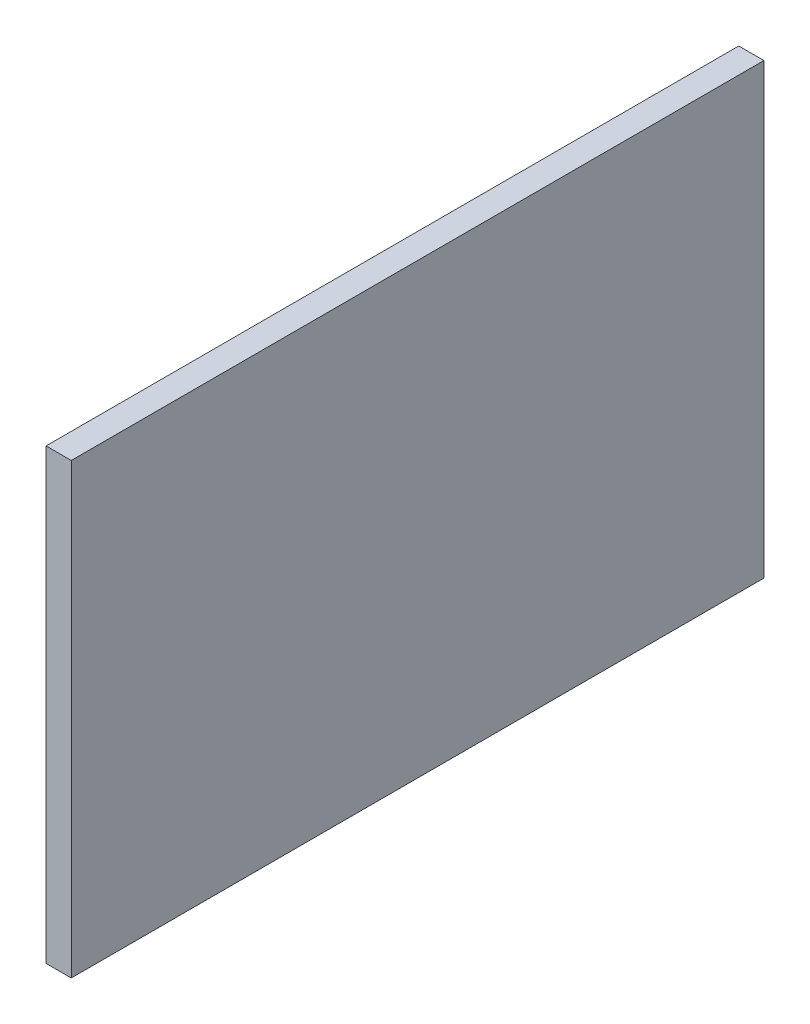
ISO-10303-21;
HEADER;
FILE_DESCRIPTION(('STEP AP214'),'2;1');
FILE_NAME('part.step','',(''),(''),'','','');
FILE_SCHEMA(('AUTOMOTIVE_DESIGN { 1 0 10303 214 1 1 1 1 }'));
ENDSEC;
DATA;
#1=APPLICATION_CONTEXT('core data for automotive mechanical design processes');
#2=APPLICATION_PROTOCOL_DEFINITION('international standard','automotive_design',2000,#1);
#3=PRODUCT_CONTEXT('',#1,'mechanical');
#4=PRODUCT('Part','Part','',(#3));
#5=PRODUCT_RELATED_PRODUCT_CATEGORY('part','',(#4));
#6=PRODUCT_DEFINITION_FORMATION('','',#4);
#7=PRODUCT_DEFINITION_CONTEXT('part definition',#1,'design');
#8=PRODUCT_DEFINITION('design','',#6,#7);
#9=PRODUCT_DEFINITION_SHAPE('','',#8);
#10=(LENGTH_UNIT() NAMED_UNIT(*) SI_UNIT(.MILLI.,.METRE.));
#11=(NAMED_UNIT(*) PLANE_ANGLE_UNIT() SI_UNIT($,.RADIAN.));
#12=(NAMED_UNIT(*) SI_UNIT($,.STERADIAN.) SOLID_ANGLE_UNIT());
#13=UNCERTAINTY_MEASURE_WITH_UNIT(LENGTH_MEASURE(1.E-05),#10,'distance_accuracy_value','');
#14=(GEOMETRIC_REPRESENTATION_CONTEXT(3) GLOBAL_UNCERTAINTY_ASSIGNED_CONTEXT((#13)) GLOBAL_UNIT_ASSIGNED_CONTEXT((#10,
#11,#12)) REPRESENTATION_CONTEXT('',''));
#15=CARTESIAN_POINT('',(0.,0.,0.));
#16=DIRECTION('',(0.,0.,1.));
#17=DIRECTION('',(1.,0.,0.));
#18=AXIS2_PLACEMENT_3D('',#15,#16,#17);
#19=CARTESIAN_POINT('',(10.,0.,-275.));
#20=DIRECTION('',(0.,1.,0.));
#21=DIRECTION('',(0.,0.,1.));
#22=AXIS2_PLACEMENT_3D('',#19,#20,#21);
#23=PLANE('',#22);
#24=DIRECTION('',(0.,0.,-1.));
#25=VECTOR('',#24,1.);
#26=CARTESIAN_POINT('',(0.,0.,-275.));
#27=LINE('',#26,#25);
#28=CARTESIAN_POINT('',(0.,0.,0.));
#29=VERTEX_POINT('',#28);
#30=CARTESIAN_POINT('',(0.,0.,-275.));
#31=VERTEX_POINT('',#30);
#32=EDGE_CURVE('E102',#29,#31,#27,.T.);
#33=ORIENTED_EDGE('',*,*,#32,.T.);
#34=DIRECTION('',(-1.,0.,0.));
#35=VECTOR('',#34,1.);
#36=CARTESIAN_POINT('',(10.,0.,-275.));
#37=LINE('',#36,#35);
#38=CARTESIAN_POINT('',(10.,0.,-275.));
#39=VERTEX_POINT('',#38);
#40=EDGE_CURVE('E11',#39,#31,#37,.T.);
#41=ORIENTED_EDGE('',*,*,#40,.F.);
#42=DIRECTION('',(0.,0.,-1.));
#43=VECTOR('',#42,1.);
#44=CARTESIAN_POINT('',(10.,0.,-275.));
#45=LINE('',#44,#43);
#46=CARTESIAN_POINT('',(10.,0.,0.));
#47=VERTEX_POINT('',#46);
#48=EDGE_CURVE('E90',#47,#39,#45,.T.);
#49=ORIENTED_EDGE('',*,*,#48,.F.);
#50=DIRECTION('',(-1.,0.,0.));
#51=VECTOR('',#50,1.);
#52=CARTESIAN_POINT('',(10.,0.,0.));
#53=LINE('',#52,#51);
#54=EDGE_CURVE('E98',#47,#29,#53,.T.);
#55=ORIENTED_EDGE('',*,*,#54,.T.);
#56=EDGE_LOOP('',(#33,#41,#49,#55));
#57=FACE_BOUND('',#56,.T.);
#58=ADVANCED_FACE('F39',(#57),#23,.F.);
#59=CARTESIAN_POINT('',(10.,177.95,-275.));
#60=DIRECTION('',(0.,0.,1.));
#61=DIRECTION('',(1.,0.,0.));
#62=AXIS2_PLACEMENT_3D('',#59,#60,#61);
#63=PLANE('',#62);
#64=DIRECTION('',(0.,1.,0.));
#65=VECTOR('',#64,1.);
#66=CARTESIAN_POINT('',(0.,177.95,-275.));
#67=LINE('',#66,#65);
#68=CARTESIAN_POINT('',(0.,177.95,-275.));
#69=VERTEX_POINT('',#68);
#70=EDGE_CURVE('E94',#31,#69,#67,.T.);
#71=ORIENTED_EDGE('',*,*,#70,.T.);
#72=DIRECTION('',(-1.,0.,0.));
#73=VECTOR('',#72,1.);
#74=CARTESIAN_POINT('',(10.,177.95,-275.));
#75=LINE('',#74,#73);
#76=CARTESIAN_POINT('',(10.,177.95,-275.));
#77=VERTEX_POINT('',#76);
#78=EDGE_CURVE('E47',#77,#69,#75,.T.);
#79=ORIENTED_EDGE('',*,*,#78,.F.);
#80=DIRECTION('',(0.,1.,0.));
#81=VECTOR('',#80,1.);
#82=CARTESIAN_POINT('',(10.,177.95,-275.));
#83=LINE('',#82,#81);
#84=EDGE_CURVE('E85',#39,#77,#83,.T.);
#85=ORIENTED_EDGE('',*,*,#84,.F.);
#86=ORIENTED_EDGE('',*,*,#40,.T.);
#87=EDGE_LOOP('',(#71,#79,#85,#86));
#88=FACE_BOUND('',#87,.T.);
#89=ADVANCED_FACE('F93',(#88),#63,.F.);
#90=CARTESIAN_POINT('',(10.,177.95,0.));
#91=DIRECTION('',(0.,-1.,0.));
#92=DIRECTION('',(0.,0.,-1.));
#93=AXIS2_PLACEMENT_3D('',#90,#91,#92);
#94=PLANE('',#93);
#95=DIRECTION('',(0.,0.,1.));
#96=VECTOR('',#95,1.);
#97=CARTESIAN_POINT('',(0.,177.95,0.));
#98=LINE('',#97,#96);
#99=CARTESIAN_POINT('',(0.,177.95,0.));
#100=VERTEX_POINT('',#99);
#101=EDGE_CURVE('E72',#69,#100,#98,.T.);
#102=ORIENTED_EDGE('',*,*,#101,.T.);
#103=DIRECTION('',(-1.,0.,0.));
#104=VECTOR('',#103,1.);
#105=CARTESIAN_POINT('',(10.,177.95,0.));
#106=LINE('',#105,#104);
#107=CARTESIAN_POINT('',(10.,177.95,0.));
#108=VERTEX_POINT('',#107);
#109=EDGE_CURVE('E95',#108,#100,#106,.T.);
#110=ORIENTED_EDGE('',*,*,#109,.F.);
#111=DIRECTION('',(0.,0.,1.));
#112=VECTOR('',#111,1.);
#113=CARTESIAN_POINT('',(10.,177.95,0.));
#114=LINE('',#113,#112);
#115=EDGE_CURVE('E88',#77,#108,#114,.T.);
#116=ORIENTED_EDGE('',*,*,#115,.F.);
#117=ORIENTED_EDGE('',*,*,#78,.T.);
#118=EDGE_LOOP('',(#102,#110,#116,#117));
#119=FACE_BOUND('',#118,.T.);
#120=ADVANCED_FACE('F96',(#119),#94,.F.);
#121=CARTESIAN_POINT('',(10.,0.,0.));
#122=DIRECTION('',(0.,0.,-1.));
#123=DIRECTION('',(-1.,0.,0.));
#124=AXIS2_PLACEMENT_3D('',#121,#122,#123);
#125=PLANE('',#124);
#126=DIRECTION('',(0.,-1.,0.));
#127=VECTOR('',#126,1.);
#128=CARTESIAN_POINT('',(0.,0.,0.));
#129=LINE('',#128,#127);
#130=EDGE_CURVE('E78',#100,#29,#129,.T.);
#131=ORIENTED_EDGE('',*,*,#130,.T.);
#132=ORIENTED_EDGE('',*,*,#54,.F.);
#133=DIRECTION('',(0.,-1.,0.));
#134=VECTOR('',#133,1.);
#135=CARTESIAN_POINT('',(10.,0.,0.));
#136=LINE('',#135,#134);
#137=EDGE_CURVE('E55',#108,#47,#136,.T.);
#138=ORIENTED_EDGE('',*,*,#137,.F.);
#139=ORIENTED_EDGE('',*,*,#109,.T.);
#140=EDGE_LOOP('',(#131,#132,#138,#139));
#141=FACE_BOUND('',#140,.T.);
#142=ADVANCED_FACE('F109',(#141),#125,.F.);
#143=CARTESIAN_POINT('',(10.,0.,0.));
#144=DIRECTION('',(-1.,0.,0.));
#145=DIRECTION('',(0.,0.,1.));
#146=AXIS2_PLACEMENT_3D('',#143,#144,#145);
#147=PLANE('',#146);
#148=ORIENTED_EDGE('',*,*,#48,.T.);
#149=ORIENTED_EDGE('',*,*,#84,.T.);
#150=ORIENTED_EDGE('',*,*,#115,.T.);
#151=ORIENTED_EDGE('',*,*,#137,.T.);
#152=EDGE_LOOP('',(#148,#149,#150,#151));
#153=FACE_BOUND('',#152,.T.);
#154=ADVANCED_FACE('F86',(#153),#147,.F.);
#155=CARTESIAN_POINT('',(0.,0.,0.));
#156=DIRECTION('',(-1.,0.,0.));
#157=DIRECTION('',(0.,0.,1.));
#158=AXIS2_PLACEMENT_3D('',#155,#156,#157);
#159=PLANE('',#158);
#160=ORIENTED_EDGE('',*,*,#32,.F.);
#161=ORIENTED_EDGE('',*,*,#130,.F.);
#162=ORIENTED_EDGE('',*,*,#101,.F.);
#163=ORIENTED_EDGE('',*,*,#70,.F.);
#164=EDGE_LOOP('',(#160,#161,#162,#163));
#165=FACE_BOUND('',#164,.T.);
#166=ADVANCED_FACE('F112',(#165),#159,.T.);
#167=CLOSED_SHELL('',(#58,#89,#120,#142,#154,#166));
#168=MANIFOLD_SOLID_BREP('B2',#167);
#169=ADVANCED_BREP_SHAPE_REPRESENTATION('',(#18,#168),#14);
#170=SHAPE_DEFINITION_REPRESENTATION(#9,#169);
ENDSEC;
END-ISO-10303-21;
